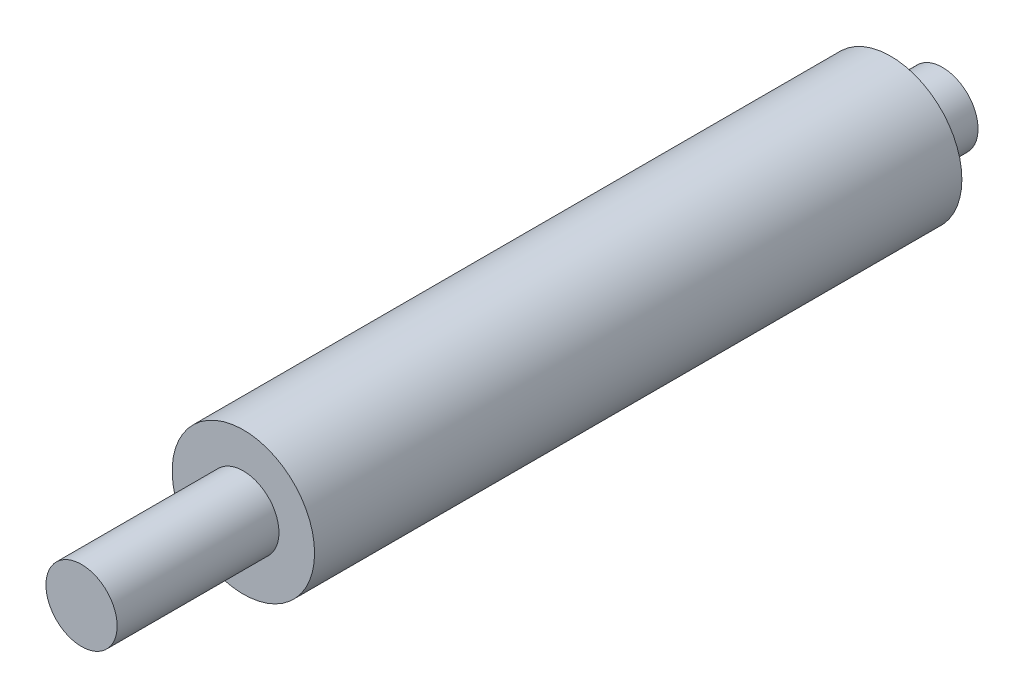
ISO-10303-21;
HEADER;
FILE_DESCRIPTION(('STEP AP214'),'2;1');
FILE_NAME('part.step','',(''),(''),'','','');
FILE_SCHEMA(('AUTOMOTIVE_DESIGN { 1 0 10303 214 1 1 1 1 }'));
ENDSEC;
DATA;
#1=APPLICATION_CONTEXT('core data for automotive mechanical design processes');
#2=APPLICATION_PROTOCOL_DEFINITION('international standard','automotive_design',2000,#1);
#3=PRODUCT_CONTEXT('',#1,'mechanical');
#4=PRODUCT('Part','Part','',(#3));
#5=PRODUCT_RELATED_PRODUCT_CATEGORY('part','',(#4));
#6=PRODUCT_DEFINITION_FORMATION('','',#4);
#7=PRODUCT_DEFINITION_CONTEXT('part definition',#1,'design');
#8=PRODUCT_DEFINITION('design','',#6,#7);
#9=PRODUCT_DEFINITION_SHAPE('','',#8);
#10=(LENGTH_UNIT() NAMED_UNIT(*) SI_UNIT(.MILLI.,.METRE.));
#11=(NAMED_UNIT(*) PLANE_ANGLE_UNIT() SI_UNIT($,.RADIAN.));
#12=(NAMED_UNIT(*) SI_UNIT($,.STERADIAN.) SOLID_ANGLE_UNIT());
#13=UNCERTAINTY_MEASURE_WITH_UNIT(LENGTH_MEASURE(1.E-05),#10,'distance_accuracy_value','');
#14=(GEOMETRIC_REPRESENTATION_CONTEXT(3) GLOBAL_UNCERTAINTY_ASSIGNED_CONTEXT((#13)) GLOBAL_UNIT_ASSIGNED_CONTEXT((#10,
#11,#12)) REPRESENTATION_CONTEXT('',''));
#15=CARTESIAN_POINT('',(0.,0.,0.));
#16=DIRECTION('',(0.,0.,1.));
#17=DIRECTION('',(1.,0.,0.));
#18=AXIS2_PLACEMENT_3D('',#15,#16,#17);
#19=CARTESIAN_POINT('',(0.,0.,20.));
#20=DIRECTION('',(0.,0.,-1.));
#21=DIRECTION('',(-1.,0.,0.));
#22=AXIS2_PLACEMENT_3D('',#19,#20,#21);
#23=CYLINDRICAL_SURFACE('',#22,2.2);
#24=CARTESIAN_POINT('',(0.,0.,20.));
#25=DIRECTION('',(0.,0.,1.));
#26=DIRECTION('',(1.,0.,0.));
#27=AXIS2_PLACEMENT_3D('',#24,#25,#26);
#28=CIRCLE('',#27,2.2);
#29=CARTESIAN_POINT('',(2.2,0.,20.));
#30=VERTEX_POINT('',#29);
#31=EDGE_CURVE('E45',#30,#30,#28,.T.);
#32=ORIENTED_EDGE('',*,*,#31,.F.);
#33=EDGE_LOOP('',(#32));
#34=FACE_BOUND('',#33,.T.);
#35=CARTESIAN_POINT('',(0.,0.,0.));
#36=DIRECTION('',(0.,0.,1.));
#37=DIRECTION('',(1.,0.,0.));
#38=AXIS2_PLACEMENT_3D('',#35,#36,#37);
#39=CIRCLE('',#38,2.2);
#40=CARTESIAN_POINT('',(2.2,0.,0.));
#41=VERTEX_POINT('',#40);
#42=EDGE_CURVE('E36',#41,#41,#39,.T.);
#43=ORIENTED_EDGE('',*,*,#42,.T.);
#44=EDGE_LOOP('',(#43));
#45=FACE_BOUND('',#44,.T.);
#46=ADVANCED_FACE('F33',(#34,#45),#23,.T.);
#47=CARTESIAN_POINT('',(0.,0.,20.));
#48=DIRECTION('',(0.,0.,1.));
#49=DIRECTION('',(1.,0.,0.));
#50=AXIS2_PLACEMENT_3D('',#47,#48,#49);
#51=PLANE('',#50);
#52=CARTESIAN_POINT('',(0.,0.,20.));
#53=DIRECTION('',(0.,0.,1.));
#54=DIRECTION('',(1.,0.,0.));
#55=AXIS2_PLACEMENT_3D('',#52,#53,#54);
#56=CIRCLE('',#55,1.1);
#57=CARTESIAN_POINT('',(1.1,0.,20.));
#58=VERTEX_POINT('',#57);
#59=EDGE_CURVE('E40',#58,#58,#56,.T.);
#60=ORIENTED_EDGE('',*,*,#59,.F.);
#61=EDGE_LOOP('',(#60));
#62=FACE_BOUND('',#61,.T.);
#63=ORIENTED_EDGE('',*,*,#31,.T.);
#64=EDGE_LOOP('',(#63));
#65=FACE_BOUND('',#64,.T.);
#66=ADVANCED_FACE('F62',(#62,#65),#51,.T.);
#67=CARTESIAN_POINT('',(0.,0.,0.));
#68=DIRECTION('',(0.,0.,1.));
#69=DIRECTION('',(1.,0.,0.));
#70=AXIS2_PLACEMENT_3D('',#67,#68,#69);
#71=PLANE('',#70);
#72=CARTESIAN_POINT('',(0.,0.,0.));
#73=DIRECTION('',(0.,0.,-1.));
#74=DIRECTION('',(-1.,0.,0.));
#75=AXIS2_PLACEMENT_3D('',#72,#73,#74);
#76=CIRCLE('',#75,1.1);
#77=CARTESIAN_POINT('',(-1.1,0.,0.));
#78=VERTEX_POINT('',#77);
#79=EDGE_CURVE('E10',#78,#78,#76,.T.);
#80=ORIENTED_EDGE('',*,*,#79,.F.);
#81=EDGE_LOOP('',(#80));
#82=FACE_BOUND('',#81,.T.);
#83=ORIENTED_EDGE('',*,*,#42,.F.);
#84=EDGE_LOOP('',(#83));
#85=FACE_BOUND('',#84,.T.);
#86=ADVANCED_FACE('F59',(#82,#85),#71,.F.);
#87=CARTESIAN_POINT('',(0.,0.,25.));
#88=DIRECTION('',(0.,0.,-1.));
#89=DIRECTION('',(-1.,0.,0.));
#90=AXIS2_PLACEMENT_3D('',#87,#88,#89);
#91=CYLINDRICAL_SURFACE('',#90,1.1);
#92=CARTESIAN_POINT('',(0.,0.,25.));
#93=DIRECTION('',(0.,0.,1.));
#94=DIRECTION('',(1.,0.,0.));
#95=AXIS2_PLACEMENT_3D('',#92,#93,#94);
#96=CIRCLE('',#95,1.1);
#97=CARTESIAN_POINT('',(1.1,0.,25.));
#98=VERTEX_POINT('',#97);
#99=EDGE_CURVE('E50',#98,#98,#96,.T.);
#100=ORIENTED_EDGE('',*,*,#99,.F.);
#101=EDGE_LOOP('',(#100));
#102=FACE_BOUND('',#101,.T.);
#103=ORIENTED_EDGE('',*,*,#59,.T.);
#104=EDGE_LOOP('',(#103));
#105=FACE_BOUND('',#104,.T.);
#106=ADVANCED_FACE('F61',(#102,#105),#91,.T.);
#107=CARTESIAN_POINT('',(0.,0.,25.));
#108=DIRECTION('',(0.,0.,1.));
#109=DIRECTION('',(1.,0.,0.));
#110=AXIS2_PLACEMENT_3D('',#107,#108,#109);
#111=PLANE('',#110);
#112=ORIENTED_EDGE('',*,*,#99,.T.);
#113=EDGE_LOOP('',(#112));
#114=FACE_BOUND('',#113,.T.);
#115=ADVANCED_FACE('F68',(#114),#111,.T.);
#116=CARTESIAN_POINT('',(0.,0.,-1.6));
#117=DIRECTION('',(0.,0.,1.));
#118=DIRECTION('',(1.,0.,0.));
#119=AXIS2_PLACEMENT_3D('',#116,#117,#118);
#120=CYLINDRICAL_SURFACE('',#119,1.1);
#121=CARTESIAN_POINT('',(0.,0.,-1.6));
#122=DIRECTION('',(0.,0.,-1.));
#123=DIRECTION('',(-1.,0.,0.));
#124=AXIS2_PLACEMENT_3D('',#121,#122,#123);
#125=CIRCLE('',#124,1.1);
#126=CARTESIAN_POINT('',(-1.1,0.,-1.6));
#127=VERTEX_POINT('',#126);
#128=EDGE_CURVE('E49',#127,#127,#125,.T.);
#129=ORIENTED_EDGE('',*,*,#128,.F.);
#130=EDGE_LOOP('',(#129));
#131=FACE_BOUND('',#130,.T.);
#132=ORIENTED_EDGE('',*,*,#79,.T.);
#133=EDGE_LOOP('',(#132));
#134=FACE_BOUND('',#133,.T.);
#135=ADVANCED_FACE('F96',(#131,#134),#120,.T.);
#136=CARTESIAN_POINT('',(0.,0.,-1.6));
#137=DIRECTION('',(0.,0.,-1.));
#138=DIRECTION('',(-1.,0.,0.));
#139=AXIS2_PLACEMENT_3D('',#136,#137,#138);
#140=PLANE('',#139);
#141=ORIENTED_EDGE('',*,*,#128,.T.);
#142=EDGE_LOOP('',(#141));
#143=FACE_BOUND('',#142,.T.);
#144=ADVANCED_FACE('F110',(#143),#140,.T.);
#145=CLOSED_SHELL('',(#46,#66,#86,#106,#115,#135,#144));
#146=MANIFOLD_SOLID_BREP('B2',#145);
#147=ADVANCED_BREP_SHAPE_REPRESENTATION('',(#18,#146),#14);
#148=SHAPE_DEFINITION_REPRESENTATION(#9,#147);
ENDSEC;
END-ISO-10303-21;
